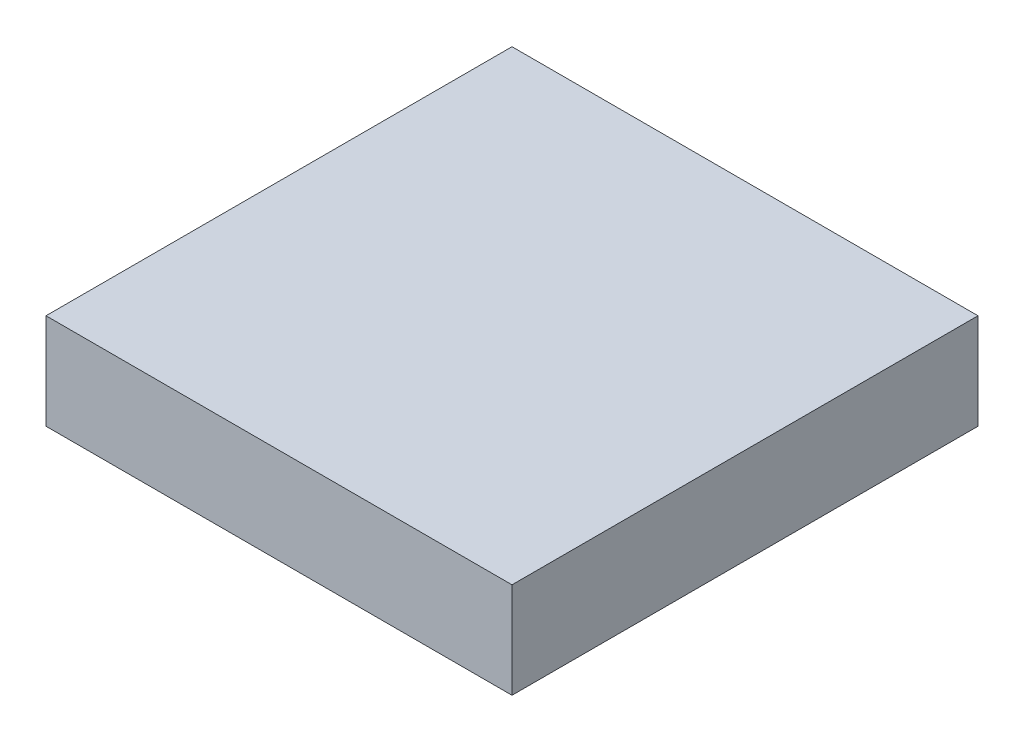
ISO-10303-21;
HEADER;
FILE_DESCRIPTION(('STEP AP214'),'2;1');
FILE_NAME('part.step','',(''),(''),'','','');
FILE_SCHEMA(('AUTOMOTIVE_DESIGN { 1 0 10303 214 1 1 1 1 }'));
ENDSEC;
DATA;
#1=APPLICATION_CONTEXT('core data for automotive mechanical design processes');
#2=APPLICATION_PROTOCOL_DEFINITION('international standard','automotive_design',2000,#1);
#3=PRODUCT_CONTEXT('',#1,'mechanical');
#4=PRODUCT('Part','Part','',(#3));
#5=PRODUCT_RELATED_PRODUCT_CATEGORY('part','',(#4));
#6=PRODUCT_DEFINITION_FORMATION('','',#4);
#7=PRODUCT_DEFINITION_CONTEXT('part definition',#1,'design');
#8=PRODUCT_DEFINITION('design','',#6,#7);
#9=PRODUCT_DEFINITION_SHAPE('','',#8);
#10=(LENGTH_UNIT() NAMED_UNIT(*) SI_UNIT(.MILLI.,.METRE.));
#11=(NAMED_UNIT(*) PLANE_ANGLE_UNIT() SI_UNIT($,.RADIAN.));
#12=(NAMED_UNIT(*) SI_UNIT($,.STERADIAN.) SOLID_ANGLE_UNIT());
#13=UNCERTAINTY_MEASURE_WITH_UNIT(LENGTH_MEASURE(1.E-05),#10,'distance_accuracy_value','');
#14=(GEOMETRIC_REPRESENTATION_CONTEXT(3) GLOBAL_UNCERTAINTY_ASSIGNED_CONTEXT((#13)) GLOBAL_UNIT_ASSIGNED_CONTEXT((#10,
#11,#12)) REPRESENTATION_CONTEXT('',''));
#15=CARTESIAN_POINT('',(0.,0.,0.));
#16=DIRECTION('',(0.,0.,1.));
#17=DIRECTION('',(1.,0.,0.));
#18=AXIS2_PLACEMENT_3D('',#15,#16,#17);
#19=CARTESIAN_POINT('',(44.45,18.25625,-44.45));
#20=DIRECTION('',(-1.,0.,0.));
#21=DIRECTION('',(0.,0.,1.));
#22=AXIS2_PLACEMENT_3D('',#19,#20,#21);
#23=PLANE('',#22);
#24=DIRECTION('',(0.,0.,-1.));
#25=VECTOR('',#24,1.);
#26=CARTESIAN_POINT('',(44.45,0.,-44.45));
#27=LINE('',#26,#25);
#28=CARTESIAN_POINT('',(44.45,0.,44.45));
#29=VERTEX_POINT('',#28);
#30=CARTESIAN_POINT('',(44.45,0.,-44.45));
#31=VERTEX_POINT('',#30);
#32=EDGE_CURVE('E95',#29,#31,#27,.T.);
#33=ORIENTED_EDGE('',*,*,#32,.T.);
#34=DIRECTION('',(0.,-1.,0.));
#35=VECTOR('',#34,1.);
#36=CARTESIAN_POINT('',(44.45,18.25625,-44.45));
#37=LINE('',#36,#35);
#38=CARTESIAN_POINT('',(44.45,18.25625,-44.45));
#39=VERTEX_POINT('',#38);
#40=EDGE_CURVE('E11',#39,#31,#37,.T.);
#41=ORIENTED_EDGE('',*,*,#40,.F.);
#42=DIRECTION('',(0.,0.,-1.));
#43=VECTOR('',#42,1.);
#44=CARTESIAN_POINT('',(44.45,18.25625,-44.45));
#45=LINE('',#44,#43);
#46=CARTESIAN_POINT('',(44.45,18.25625,44.45));
#47=VERTEX_POINT('',#46);
#48=EDGE_CURVE('E83',#47,#39,#45,.T.);
#49=ORIENTED_EDGE('',*,*,#48,.F.);
#50=DIRECTION('',(0.,-1.,0.));
#51=VECTOR('',#50,1.);
#52=CARTESIAN_POINT('',(44.45,18.25625,44.45));
#53=LINE('',#52,#51);
#54=EDGE_CURVE('E91',#47,#29,#53,.T.);
#55=ORIENTED_EDGE('',*,*,#54,.T.);
#56=EDGE_LOOP('',(#33,#41,#49,#55));
#57=FACE_BOUND('',#56,.T.);
#58=ADVANCED_FACE('F32',(#57),#23,.F.);
#59=CARTESIAN_POINT('',(-44.45,18.25625,-44.45));
#60=DIRECTION('',(0.,0.,1.));
#61=DIRECTION('',(1.,0.,0.));
#62=AXIS2_PLACEMENT_3D('',#59,#60,#61);
#63=PLANE('',#62);
#64=DIRECTION('',(-1.,0.,0.));
#65=VECTOR('',#64,1.);
#66=CARTESIAN_POINT('',(-44.45,0.,-44.45));
#67=LINE('',#66,#65);
#68=CARTESIAN_POINT('',(-44.45,0.,-44.45));
#69=VERTEX_POINT('',#68);
#70=EDGE_CURVE('E87',#31,#69,#67,.T.);
#71=ORIENTED_EDGE('',*,*,#70,.T.);
#72=DIRECTION('',(0.,-1.,0.));
#73=VECTOR('',#72,1.);
#74=CARTESIAN_POINT('',(-44.45,18.25625,-44.45));
#75=LINE('',#74,#73);
#76=CARTESIAN_POINT('',(-44.45,18.25625,-44.45));
#77=VERTEX_POINT('',#76);
#78=EDGE_CURVE('E40',#77,#69,#75,.T.);
#79=ORIENTED_EDGE('',*,*,#78,.F.);
#80=DIRECTION('',(-1.,0.,0.));
#81=VECTOR('',#80,1.);
#82=CARTESIAN_POINT('',(-44.45,18.25625,-44.45));
#83=LINE('',#82,#81);
#84=EDGE_CURVE('E78',#39,#77,#83,.T.);
#85=ORIENTED_EDGE('',*,*,#84,.F.);
#86=ORIENTED_EDGE('',*,*,#40,.T.);
#87=EDGE_LOOP('',(#71,#79,#85,#86));
#88=FACE_BOUND('',#87,.T.);
#89=ADVANCED_FACE('F86',(#88),#63,.F.);
#90=CARTESIAN_POINT('',(-44.45,18.25625,-44.45));
#91=DIRECTION('',(1.,0.,0.));
#92=DIRECTION('',(0.,0.,-1.));
#93=AXIS2_PLACEMENT_3D('',#90,#91,#92);
#94=PLANE('',#93);
#95=DIRECTION('',(0.,0.,1.));
#96=VECTOR('',#95,1.);
#97=CARTESIAN_POINT('',(-44.45,0.,-44.45));
#98=LINE('',#97,#96);
#99=CARTESIAN_POINT('',(-44.45,0.,44.45));
#100=VERTEX_POINT('',#99);
#101=EDGE_CURVE('E65',#69,#100,#98,.T.);
#102=ORIENTED_EDGE('',*,*,#101,.T.);
#103=DIRECTION('',(0.,-1.,0.));
#104=VECTOR('',#103,1.);
#105=CARTESIAN_POINT('',(-44.45,18.25625,44.45));
#106=LINE('',#105,#104);
#107=CARTESIAN_POINT('',(-44.45,18.25625,44.45));
#108=VERTEX_POINT('',#107);
#109=EDGE_CURVE('E88',#108,#100,#106,.T.);
#110=ORIENTED_EDGE('',*,*,#109,.F.);
#111=DIRECTION('',(0.,0.,1.));
#112=VECTOR('',#111,1.);
#113=CARTESIAN_POINT('',(-44.45,18.25625,-44.45));
#114=LINE('',#113,#112);
#115=EDGE_CURVE('E81',#77,#108,#114,.T.);
#116=ORIENTED_EDGE('',*,*,#115,.F.);
#117=ORIENTED_EDGE('',*,*,#78,.T.);
#118=EDGE_LOOP('',(#102,#110,#116,#117));
#119=FACE_BOUND('',#118,.T.);
#120=ADVANCED_FACE('F89',(#119),#94,.F.);
#121=CARTESIAN_POINT('',(-44.45,18.25625,44.45));
#122=DIRECTION('',(0.,0.,-1.));
#123=DIRECTION('',(-1.,0.,0.));
#124=AXIS2_PLACEMENT_3D('',#121,#122,#123);
#125=PLANE('',#124);
#126=DIRECTION('',(1.,0.,0.));
#127=VECTOR('',#126,1.);
#128=CARTESIAN_POINT('',(-44.45,0.,44.45));
#129=LINE('',#128,#127);
#130=EDGE_CURVE('E71',#100,#29,#129,.T.);
#131=ORIENTED_EDGE('',*,*,#130,.T.);
#132=ORIENTED_EDGE('',*,*,#54,.F.);
#133=DIRECTION('',(1.,0.,0.));
#134=VECTOR('',#133,1.);
#135=CARTESIAN_POINT('',(-44.45,18.25625,44.45));
#136=LINE('',#135,#134);
#137=EDGE_CURVE('E48',#108,#47,#136,.T.);
#138=ORIENTED_EDGE('',*,*,#137,.F.);
#139=ORIENTED_EDGE('',*,*,#109,.T.);
#140=EDGE_LOOP('',(#131,#132,#138,#139));
#141=FACE_BOUND('',#140,.T.);
#142=ADVANCED_FACE('F102',(#141),#125,.F.);
#143=CARTESIAN_POINT('',(0.,18.25625,0.));
#144=DIRECTION('',(0.,1.,0.));
#145=DIRECTION('',(0.,0.,1.));
#146=AXIS2_PLACEMENT_3D('',#143,#144,#145);
#147=PLANE('',#146);
#148=ORIENTED_EDGE('',*,*,#48,.T.);
#149=ORIENTED_EDGE('',*,*,#84,.T.);
#150=ORIENTED_EDGE('',*,*,#115,.T.);
#151=ORIENTED_EDGE('',*,*,#137,.T.);
#152=EDGE_LOOP('',(#148,#149,#150,#151));
#153=FACE_BOUND('',#152,.T.);
#154=ADVANCED_FACE('F79',(#153),#147,.T.);
#155=CARTESIAN_POINT('',(0.,0.,0.));
#156=DIRECTION('',(0.,1.,0.));
#157=DIRECTION('',(0.,0.,1.));
#158=AXIS2_PLACEMENT_3D('',#155,#156,#157);
#159=PLANE('',#158);
#160=ORIENTED_EDGE('',*,*,#32,.F.);
#161=ORIENTED_EDGE('',*,*,#130,.F.);
#162=ORIENTED_EDGE('',*,*,#101,.F.);
#163=ORIENTED_EDGE('',*,*,#70,.F.);
#164=EDGE_LOOP('',(#160,#161,#162,#163));
#165=FACE_BOUND('',#164,.T.);
#166=ADVANCED_FACE('F105',(#165),#159,.F.);
#167=CLOSED_SHELL('',(#58,#89,#120,#142,#154,#166));
#168=MANIFOLD_SOLID_BREP('B2',#167);
#169=ADVANCED_BREP_SHAPE_REPRESENTATION('',(#18,#168),#14);
#170=SHAPE_DEFINITION_REPRESENTATION(#9,#169);
ENDSEC;
END-ISO-10303-21;
